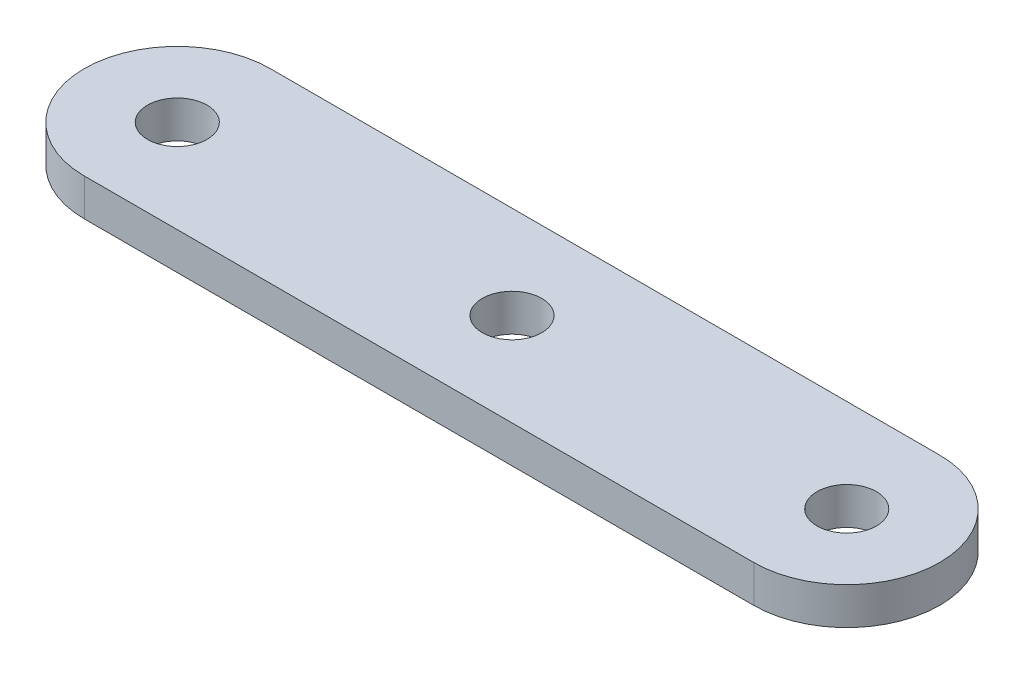
ISO-10303-21;
HEADER;
FILE_DESCRIPTION(('STEP AP214'),'2;1');
FILE_NAME('part.step','',(''),(''),'','','');
FILE_SCHEMA(('AUTOMOTIVE_DESIGN { 1 0 10303 214 1 1 1 1 }'));
ENDSEC;
DATA;
#1=APPLICATION_CONTEXT('core data for automotive mechanical design processes');
#2=APPLICATION_PROTOCOL_DEFINITION('international standard','automotive_design',2000,#1);
#3=PRODUCT_CONTEXT('',#1,'mechanical');
#4=PRODUCT('Part','Part','',(#3));
#5=PRODUCT_RELATED_PRODUCT_CATEGORY('part','',(#4));
#6=PRODUCT_DEFINITION_FORMATION('','',#4);
#7=PRODUCT_DEFINITION_CONTEXT('part definition',#1,'design');
#8=PRODUCT_DEFINITION('design','',#6,#7);
#9=PRODUCT_DEFINITION_SHAPE('','',#8);
#10=(LENGTH_UNIT() NAMED_UNIT(*) SI_UNIT(.MILLI.,.METRE.));
#11=(NAMED_UNIT(*) PLANE_ANGLE_UNIT() SI_UNIT($,.RADIAN.));
#12=(NAMED_UNIT(*) SI_UNIT($,.STERADIAN.) SOLID_ANGLE_UNIT());
#13=UNCERTAINTY_MEASURE_WITH_UNIT(LENGTH_MEASURE(1.E-05),#10,'distance_accuracy_value','');
#14=(GEOMETRIC_REPRESENTATION_CONTEXT(3) GLOBAL_UNCERTAINTY_ASSIGNED_CONTEXT((#13)) GLOBAL_UNIT_ASSIGNED_CONTEXT((#10,
#11,#12)) REPRESENTATION_CONTEXT('',''));
#15=CARTESIAN_POINT('',(0.,0.,0.));
#16=DIRECTION('',(0.,0.,1.));
#17=DIRECTION('',(1.,0.,0.));
#18=AXIS2_PLACEMENT_3D('',#15,#16,#17);
#19=CARTESIAN_POINT('',(-18.,2.,0.));
#20=DIRECTION('',(0.,1.,0.));
#21=DIRECTION('',(0.,0.,1.));
#22=AXIS2_PLACEMENT_3D('',#19,#20,#21);
#23=PLANE('',#22);
#24=CARTESIAN_POINT('',(-18.,2.,0.));
#25=DIRECTION('',(0.,1.,0.));
#26=DIRECTION('',(0.,0.,-1.));
#27=AXIS2_PLACEMENT_3D('',#24,#25,#26);
#28=CIRCLE('',#27,1.6);
#29=CARTESIAN_POINT('',(-18.,2.,-1.6));
#30=VERTEX_POINT('',#29);
#31=EDGE_CURVE('E114',#30,#30,#28,.T.);
#32=ORIENTED_EDGE('',*,*,#31,.F.);
#33=EDGE_LOOP('',(#32));
#34=FACE_BOUND('',#33,.T.);
#35=CARTESIAN_POINT('',(-18.,2.,0.));
#36=DIRECTION('',(0.,1.,0.));
#37=DIRECTION('',(0.,0.,1.));
#38=AXIS2_PLACEMENT_3D('',#35,#36,#37);
#39=CIRCLE('',#38,5.);
#40=CARTESIAN_POINT('',(-18.,2.,-5.));
#41=VERTEX_POINT('',#40);
#42=CARTESIAN_POINT('',(-18.,2.,5.));
#43=VERTEX_POINT('',#42);
#44=EDGE_CURVE('E84',#41,#43,#39,.T.);
#45=ORIENTED_EDGE('',*,*,#44,.T.);
#46=DIRECTION('',(1.,0.,0.));
#47=VECTOR('',#46,1.);
#48=CARTESIAN_POINT('',(-18.,2.,5.));
#49=LINE('',#48,#47);
#50=CARTESIAN_POINT('',(18.,2.,5.));
#51=VERTEX_POINT('',#50);
#52=EDGE_CURVE('E79',#43,#51,#49,.T.);
#53=ORIENTED_EDGE('',*,*,#52,.T.);
#54=CARTESIAN_POINT('',(18.,2.,0.));
#55=DIRECTION('',(0.,1.,0.));
#56=DIRECTION('',(0.,0.,1.));
#57=AXIS2_PLACEMENT_3D('',#54,#55,#56);
#58=CIRCLE('',#57,5.);
#59=CARTESIAN_POINT('',(18.,2.,-5.));
#60=VERTEX_POINT('',#59);
#61=EDGE_CURVE('E82',#51,#60,#58,.T.);
#62=ORIENTED_EDGE('',*,*,#61,.T.);
#63=DIRECTION('',(-1.,0.,0.));
#64=VECTOR('',#63,1.);
#65=CARTESIAN_POINT('',(-18.,2.,-5.));
#66=LINE('',#65,#64);
#67=EDGE_CURVE('E49',#60,#41,#66,.T.);
#68=ORIENTED_EDGE('',*,*,#67,.T.);
#69=EDGE_LOOP('',(#45,#53,#62,#68));
#70=FACE_BOUND('',#69,.T.);
#71=CARTESIAN_POINT('',(18.,2.,0.));
#72=DIRECTION('',(0.,1.,0.));
#73=DIRECTION('',(0.,0.,1.));
#74=AXIS2_PLACEMENT_3D('',#71,#72,#73);
#75=CIRCLE('',#74,1.6);
#76=CARTESIAN_POINT('',(18.,2.,1.6));
#77=VERTEX_POINT('',#76);
#78=EDGE_CURVE('E99',#77,#77,#75,.T.);
#79=ORIENTED_EDGE('',*,*,#78,.F.);
#80=EDGE_LOOP('',(#79));
#81=FACE_BOUND('',#80,.T.);
#82=CARTESIAN_POINT('',(0.,2.,0.));
#83=DIRECTION('',(0.,1.,0.));
#84=DIRECTION('',(0.,0.,1.));
#85=AXIS2_PLACEMENT_3D('',#82,#83,#84);
#86=CIRCLE('',#85,1.6);
#87=CARTESIAN_POINT('',(0.,2.,1.6));
#88=VERTEX_POINT('',#87);
#89=EDGE_CURVE('E120',#88,#88,#86,.T.);
#90=ORIENTED_EDGE('',*,*,#89,.F.);
#91=EDGE_LOOP('',(#90));
#92=FACE_BOUND('',#91,.T.);
#93=ADVANCED_FACE('F32',(#34,#70,#81,#92),#23,.T.);
#94=CARTESIAN_POINT('',(-18.,0.,0.));
#95=DIRECTION('',(0.,1.,0.));
#96=DIRECTION('',(0.,0.,1.));
#97=AXIS2_PLACEMENT_3D('',#94,#95,#96);
#98=PLANE('',#97);
#99=CARTESIAN_POINT('',(-18.,0.,0.));
#100=DIRECTION('',(0.,1.,0.));
#101=DIRECTION('',(0.,0.,-1.));
#102=AXIS2_PLACEMENT_3D('',#99,#100,#101);
#103=CIRCLE('',#102,1.6);
#104=CARTESIAN_POINT('',(-18.,0.,-1.6));
#105=VERTEX_POINT('',#104);
#106=EDGE_CURVE('E117',#105,#105,#103,.T.);
#107=ORIENTED_EDGE('',*,*,#106,.T.);
#108=EDGE_LOOP('',(#107));
#109=FACE_BOUND('',#108,.T.);
#110=CARTESIAN_POINT('',(-18.,0.,0.));
#111=DIRECTION('',(0.,1.,0.));
#112=DIRECTION('',(0.,0.,1.));
#113=AXIS2_PLACEMENT_3D('',#110,#111,#112);
#114=CIRCLE('',#113,5.);
#115=CARTESIAN_POINT('',(-18.,0.,-5.));
#116=VERTEX_POINT('',#115);
#117=CARTESIAN_POINT('',(-18.,0.,5.));
#118=VERTEX_POINT('',#117);
#119=EDGE_CURVE('E96',#116,#118,#114,.T.);
#120=ORIENTED_EDGE('',*,*,#119,.F.);
#121=DIRECTION('',(-1.,0.,0.));
#122=VECTOR('',#121,1.);
#123=CARTESIAN_POINT('',(-18.,0.,-5.));
#124=LINE('',#123,#122);
#125=CARTESIAN_POINT('',(18.,0.,-5.));
#126=VERTEX_POINT('',#125);
#127=EDGE_CURVE('E72',#126,#116,#124,.T.);
#128=ORIENTED_EDGE('',*,*,#127,.F.);
#129=CARTESIAN_POINT('',(18.,0.,0.));
#130=DIRECTION('',(0.,1.,0.));
#131=DIRECTION('',(0.,0.,1.));
#132=AXIS2_PLACEMENT_3D('',#129,#130,#131);
#133=CIRCLE('',#132,5.);
#134=CARTESIAN_POINT('',(18.,0.,5.));
#135=VERTEX_POINT('',#134);
#136=EDGE_CURVE('E66',#135,#126,#133,.T.);
#137=ORIENTED_EDGE('',*,*,#136,.F.);
#138=DIRECTION('',(1.,0.,0.));
#139=VECTOR('',#138,1.);
#140=CARTESIAN_POINT('',(-18.,0.,5.));
#141=LINE('',#140,#139);
#142=EDGE_CURVE('E88',#118,#135,#141,.T.);
#143=ORIENTED_EDGE('',*,*,#142,.F.);
#144=EDGE_LOOP('',(#120,#128,#137,#143));
#145=FACE_BOUND('',#144,.T.);
#146=CARTESIAN_POINT('',(18.,0.,0.));
#147=DIRECTION('',(0.,1.,0.));
#148=DIRECTION('',(0.,0.,1.));
#149=AXIS2_PLACEMENT_3D('',#146,#147,#148);
#150=CIRCLE('',#149,1.6);
#151=CARTESIAN_POINT('',(18.,0.,1.6));
#152=VERTEX_POINT('',#151);
#153=EDGE_CURVE('E111',#152,#152,#150,.T.);
#154=ORIENTED_EDGE('',*,*,#153,.T.);
#155=EDGE_LOOP('',(#154));
#156=FACE_BOUND('',#155,.T.);
#157=CARTESIAN_POINT('',(0.,0.,0.));
#158=DIRECTION('',(0.,1.,0.));
#159=DIRECTION('',(0.,0.,1.));
#160=AXIS2_PLACEMENT_3D('',#157,#158,#159);
#161=CIRCLE('',#160,1.6);
#162=CARTESIAN_POINT('',(0.,0.,1.6));
#163=VERTEX_POINT('',#162);
#164=EDGE_CURVE('E123',#163,#163,#161,.T.);
#165=ORIENTED_EDGE('',*,*,#164,.T.);
#166=EDGE_LOOP('',(#165));
#167=FACE_BOUND('',#166,.T.);
#168=ADVANCED_FACE('F107',(#109,#145,#156,#167),#98,.F.);
#169=CARTESIAN_POINT('',(-18.,2.,0.));
#170=DIRECTION('',(0.,-1.,0.));
#171=DIRECTION('',(0.,0.,-1.));
#172=AXIS2_PLACEMENT_3D('',#169,#170,#171);
#173=CYLINDRICAL_SURFACE('',#172,5.);
#174=ORIENTED_EDGE('',*,*,#119,.T.);
#175=DIRECTION('',(0.,-1.,0.));
#176=VECTOR('',#175,1.);
#177=CARTESIAN_POINT('',(-18.,2.,5.));
#178=LINE('',#177,#176);
#179=EDGE_CURVE('E11',#43,#118,#178,.T.);
#180=ORIENTED_EDGE('',*,*,#179,.F.);
#181=ORIENTED_EDGE('',*,*,#44,.F.);
#182=DIRECTION('',(0.,-1.,0.));
#183=VECTOR('',#182,1.);
#184=CARTESIAN_POINT('',(-18.,2.,-5.));
#185=LINE('',#184,#183);
#186=EDGE_CURVE('E92',#41,#116,#185,.T.);
#187=ORIENTED_EDGE('',*,*,#186,.T.);
#188=EDGE_LOOP('',(#174,#180,#181,#187));
#189=FACE_BOUND('',#188,.T.);
#190=ADVANCED_FACE('F34',(#189),#173,.T.);
#191=CARTESIAN_POINT('',(-18.,2.,5.));
#192=DIRECTION('',(0.,0.,-1.));
#193=DIRECTION('',(-1.,0.,0.));
#194=AXIS2_PLACEMENT_3D('',#191,#192,#193);
#195=PLANE('',#194);
#196=ORIENTED_EDGE('',*,*,#142,.T.);
#197=DIRECTION('',(0.,-1.,0.));
#198=VECTOR('',#197,1.);
#199=CARTESIAN_POINT('',(18.,2.,5.));
#200=LINE('',#199,#198);
#201=EDGE_CURVE('E41',#51,#135,#200,.T.);
#202=ORIENTED_EDGE('',*,*,#201,.F.);
#203=ORIENTED_EDGE('',*,*,#52,.F.);
#204=ORIENTED_EDGE('',*,*,#179,.T.);
#205=EDGE_LOOP('',(#196,#202,#203,#204));
#206=FACE_BOUND('',#205,.T.);
#207=ADVANCED_FACE('F87',(#206),#195,.F.);
#208=CARTESIAN_POINT('',(18.,2.,0.));
#209=DIRECTION('',(0.,-1.,0.));
#210=DIRECTION('',(0.,0.,-1.));
#211=AXIS2_PLACEMENT_3D('',#208,#209,#210);
#212=CYLINDRICAL_SURFACE('',#211,5.);
#213=ORIENTED_EDGE('',*,*,#136,.T.);
#214=DIRECTION('',(0.,-1.,0.));
#215=VECTOR('',#214,1.);
#216=CARTESIAN_POINT('',(18.,2.,-5.));
#217=LINE('',#216,#215);
#218=EDGE_CURVE('E89',#60,#126,#217,.T.);
#219=ORIENTED_EDGE('',*,*,#218,.F.);
#220=ORIENTED_EDGE('',*,*,#61,.F.);
#221=ORIENTED_EDGE('',*,*,#201,.T.);
#222=EDGE_LOOP('',(#213,#219,#220,#221));
#223=FACE_BOUND('',#222,.T.);
#224=ADVANCED_FACE('F90',(#223),#212,.T.);
#225=CARTESIAN_POINT('',(-18.,2.,-5.));
#226=DIRECTION('',(0.,0.,1.));
#227=DIRECTION('',(1.,0.,0.));
#228=AXIS2_PLACEMENT_3D('',#225,#226,#227);
#229=PLANE('',#228);
#230=ORIENTED_EDGE('',*,*,#127,.T.);
#231=ORIENTED_EDGE('',*,*,#186,.F.);
#232=ORIENTED_EDGE('',*,*,#67,.F.);
#233=ORIENTED_EDGE('',*,*,#218,.T.);
#234=EDGE_LOOP('',(#230,#231,#232,#233));
#235=FACE_BOUND('',#234,.T.);
#236=ADVANCED_FACE('F104',(#235),#229,.F.);
#237=CARTESIAN_POINT('',(18.,2.,0.));
#238=DIRECTION('',(0.,-1.,0.));
#239=DIRECTION('',(0.,0.,-1.));
#240=AXIS2_PLACEMENT_3D('',#237,#238,#239);
#241=CYLINDRICAL_SURFACE('',#240,1.6);
#242=ORIENTED_EDGE('',*,*,#78,.T.);
#243=EDGE_LOOP('',(#242));
#244=FACE_BOUND('',#243,.T.);
#245=ORIENTED_EDGE('',*,*,#153,.F.);
#246=EDGE_LOOP('',(#245));
#247=FACE_BOUND('',#246,.T.);
#248=ADVANCED_FACE('F142',(#244,#247),#241,.F.);
#249=CARTESIAN_POINT('',(-18.,2.,0.));
#250=DIRECTION('',(0.,-1.,0.));
#251=DIRECTION('',(0.,0.,-1.));
#252=AXIS2_PLACEMENT_3D('',#249,#250,#251);
#253=CYLINDRICAL_SURFACE('',#252,1.6);
#254=ORIENTED_EDGE('',*,*,#31,.T.);
#255=EDGE_LOOP('',(#254));
#256=FACE_BOUND('',#255,.T.);
#257=ORIENTED_EDGE('',*,*,#106,.F.);
#258=EDGE_LOOP('',(#257));
#259=FACE_BOUND('',#258,.T.);
#260=ADVANCED_FACE('F188',(#256,#259),#253,.F.);
#261=CARTESIAN_POINT('',(0.,2.,0.));
#262=DIRECTION('',(0.,-1.,0.));
#263=DIRECTION('',(0.,0.,-1.));
#264=AXIS2_PLACEMENT_3D('',#261,#262,#263);
#265=CYLINDRICAL_SURFACE('',#264,1.6);
#266=ORIENTED_EDGE('',*,*,#89,.T.);
#267=EDGE_LOOP('',(#266));
#268=FACE_BOUND('',#267,.T.);
#269=ORIENTED_EDGE('',*,*,#164,.F.);
#270=EDGE_LOOP('',(#269));
#271=FACE_BOUND('',#270,.T.);
#272=ADVANCED_FACE('F129',(#268,#271),#265,.F.);
#273=CLOSED_SHELL('',(#93,#168,#190,#207,#224,#236,#248,#260,#272));
#274=MANIFOLD_SOLID_BREP('B2',#273);
#275=ADVANCED_BREP_SHAPE_REPRESENTATION('',(#18,#274),#14);
#276=SHAPE_DEFINITION_REPRESENTATION(#9,#275);
ENDSEC;
END-ISO-10303-21;
